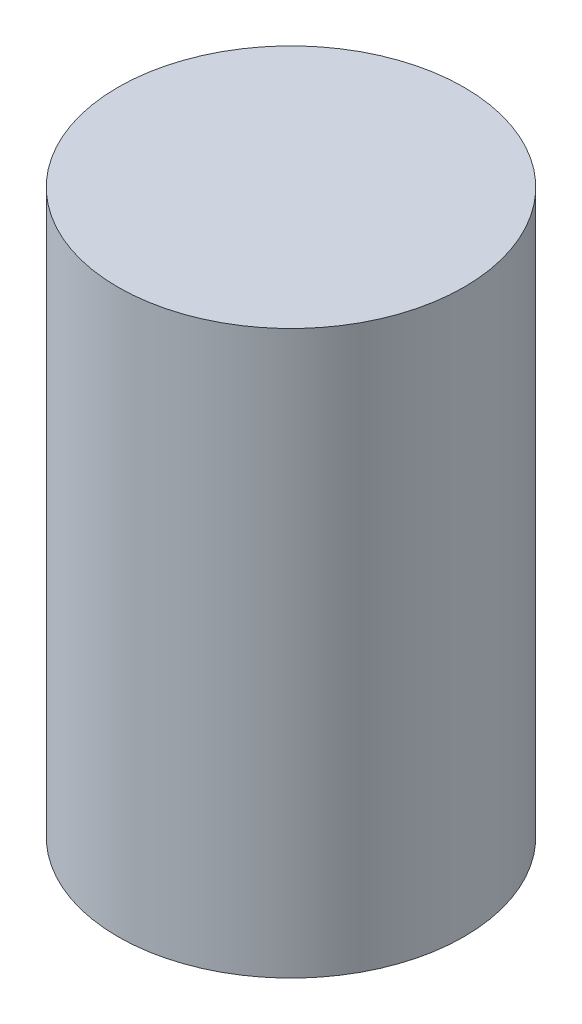
ISO-10303-21;
HEADER;
FILE_DESCRIPTION(('STEP AP214'),'2;1');
FILE_NAME('part.step','',(''),(''),'','','');
FILE_SCHEMA(('AUTOMOTIVE_DESIGN { 1 0 10303 214 1 1 1 1 }'));
ENDSEC;
DATA;
#1=APPLICATION_CONTEXT('core data for automotive mechanical design processes');
#2=APPLICATION_PROTOCOL_DEFINITION('international standard','automotive_design',2000,#1);
#3=PRODUCT_CONTEXT('',#1,'mechanical');
#4=PRODUCT('Part','Part','',(#3));
#5=PRODUCT_RELATED_PRODUCT_CATEGORY('part','',(#4));
#6=PRODUCT_DEFINITION_FORMATION('','',#4);
#7=PRODUCT_DEFINITION_CONTEXT('part definition',#1,'design');
#8=PRODUCT_DEFINITION('design','',#6,#7);
#9=PRODUCT_DEFINITION_SHAPE('','',#8);
#10=(LENGTH_UNIT() NAMED_UNIT(*) SI_UNIT(.MILLI.,.METRE.));
#11=(NAMED_UNIT(*) PLANE_ANGLE_UNIT() SI_UNIT($,.RADIAN.));
#12=(NAMED_UNIT(*) SI_UNIT($,.STERADIAN.) SOLID_ANGLE_UNIT());
#13=UNCERTAINTY_MEASURE_WITH_UNIT(LENGTH_MEASURE(1.E-05),#10,'distance_accuracy_value','');
#14=(GEOMETRIC_REPRESENTATION_CONTEXT(3) GLOBAL_UNCERTAINTY_ASSIGNED_CONTEXT((#13)) GLOBAL_UNIT_ASSIGNED_CONTEXT((#10,
#11,#12)) REPRESENTATION_CONTEXT('',''));
#15=CARTESIAN_POINT('',(0.,0.,0.));
#16=DIRECTION('',(0.,0.,1.));
#17=DIRECTION('',(1.,0.,0.));
#18=AXIS2_PLACEMENT_3D('',#15,#16,#17);
#19=CARTESIAN_POINT('',(-44.,29.,-44.));
#20=DIRECTION('',(0.,-1.,0.));
#21=DIRECTION('',(0.,0.,-1.));
#22=AXIS2_PLACEMENT_3D('',#19,#20,#21);
#23=CYLINDRICAL_SURFACE('',#22,8.);
#24=CARTESIAN_POINT('',(-44.,29.,-44.));
#25=DIRECTION('',(0.,1.,0.));
#26=DIRECTION('',(0.,0.,1.));
#27=AXIS2_PLACEMENT_3D('',#24,#25,#26);
#28=CIRCLE('',#27,8.);
#29=CARTESIAN_POINT('',(-44.,29.,-52.));
#30=VERTEX_POINT('',#29);
#31=EDGE_CURVE('E10',#30,#30,#28,.T.);
#32=CARTESIAN_POINT('',(-44.,3.,-44.));
#33=DIRECTION('',(0.,1.,0.));
#34=DIRECTION('',(0.,0.,1.));
#35=AXIS2_PLACEMENT_3D('',#32,#33,#34);
#36=CIRCLE('',#35,8.);
#37=CARTESIAN_POINT('',(-44.,3.,-52.));
#38=VERTEX_POINT('',#37);
#39=EDGE_CURVE('E37',#38,#38,#36,.T.);
#40=CARTESIAN_POINT('',(-44.,29.,-52.));
#41=CARTESIAN_POINT('',(-44.,28.7291666666667,-52.));
#42=CARTESIAN_POINT('',(-44.,28.4583333333333,-52.));
#43=CARTESIAN_POINT('',(-44.,27.9166666666667,-52.));
#44=CARTESIAN_POINT('',(-44.,27.6458333333333,-52.));
#45=CARTESIAN_POINT('',(-44.,27.1041666666667,-52.));
#46=CARTESIAN_POINT('',(-44.,26.8333333333333,-52.));
#47=CARTESIAN_POINT('',(-44.,26.2916666666667,-52.));
#48=CARTESIAN_POINT('',(-44.,26.0208333333333,-52.));
#49=CARTESIAN_POINT('',(-44.,25.4791666666667,-52.));
#50=CARTESIAN_POINT('',(-44.,25.2083333333333,-52.));
#51=CARTESIAN_POINT('',(-44.,24.6666666666667,-52.));
#52=CARTESIAN_POINT('',(-44.,24.3958333333333,-52.));
#53=CARTESIAN_POINT('',(-44.,23.8541666666667,-52.));
#54=CARTESIAN_POINT('',(-44.,23.5833333333333,-52.));
#55=CARTESIAN_POINT('',(-44.,23.0416666666667,-52.));
#56=CARTESIAN_POINT('',(-44.,22.7708333333333,-52.));
#57=CARTESIAN_POINT('',(-44.,22.2291666666667,-52.));
#58=CARTESIAN_POINT('',(-44.,21.9583333333333,-52.));
#59=CARTESIAN_POINT('',(-44.,21.4166666666667,-52.));
#60=CARTESIAN_POINT('',(-44.,21.1458333333333,-52.));
#61=CARTESIAN_POINT('',(-44.,20.6041666666667,-52.));
#62=CARTESIAN_POINT('',(-44.,20.3333333333333,-52.));
#63=CARTESIAN_POINT('',(-44.,19.7916666666667,-52.));
#64=CARTESIAN_POINT('',(-44.,19.5208333333333,-52.));
#65=CARTESIAN_POINT('',(-44.,18.9791666666667,-52.));
#66=CARTESIAN_POINT('',(-44.,18.7083333333333,-52.));
#67=CARTESIAN_POINT('',(-44.,18.1666666666667,-52.));
#68=CARTESIAN_POINT('',(-44.,17.8958333333333,-52.));
#69=CARTESIAN_POINT('',(-44.,17.3541666666667,-52.));
#70=CARTESIAN_POINT('',(-44.,17.0833333333333,-52.));
#71=CARTESIAN_POINT('',(-44.,16.5416666666667,-52.));
#72=CARTESIAN_POINT('',(-44.,16.2708333333333,-52.));
#73=CARTESIAN_POINT('',(-44.,15.7291666666667,-52.));
#74=CARTESIAN_POINT('',(-44.,15.4583333333333,-52.));
#75=CARTESIAN_POINT('',(-44.,14.9166666666667,-52.));
#76=CARTESIAN_POINT('',(-44.,14.6458333333333,-52.));
#77=CARTESIAN_POINT('',(-44.,14.1041666666667,-52.));
#78=CARTESIAN_POINT('',(-44.,13.8333333333333,-52.));
#79=CARTESIAN_POINT('',(-44.,13.2916666666667,-52.));
#80=CARTESIAN_POINT('',(-44.,13.0208333333333,-52.));
#81=CARTESIAN_POINT('',(-44.,12.4791666666667,-52.));
#82=CARTESIAN_POINT('',(-44.,12.2083333333333,-52.));
#83=CARTESIAN_POINT('',(-44.,11.6666666666667,-52.));
#84=CARTESIAN_POINT('',(-44.,11.3958333333333,-52.));
#85=CARTESIAN_POINT('',(-44.,10.8541666666667,-52.));
#86=CARTESIAN_POINT('',(-44.,10.5833333333333,-52.));
#87=CARTESIAN_POINT('',(-44.,10.0416666666667,-52.));
#88=CARTESIAN_POINT('',(-44.,9.77083333333333,-52.));
#89=CARTESIAN_POINT('',(-44.,9.22916666666666,-52.));
#90=CARTESIAN_POINT('',(-44.,8.95833333333333,-52.));
#91=CARTESIAN_POINT('',(-44.,8.41666666666666,-52.));
#92=CARTESIAN_POINT('',(-44.,8.14583333333333,-52.));
#93=CARTESIAN_POINT('',(-44.,7.60416666666667,-52.));
#94=CARTESIAN_POINT('',(-44.,7.33333333333333,-52.));
#95=CARTESIAN_POINT('',(-44.,6.79166666666667,-52.));
#96=CARTESIAN_POINT('',(-44.,6.52083333333333,-52.));
#97=CARTESIAN_POINT('',(-44.,5.97916666666667,-52.));
#98=CARTESIAN_POINT('',(-44.,5.70833333333333,-52.));
#99=CARTESIAN_POINT('',(-44.,5.16666666666667,-52.));
#100=CARTESIAN_POINT('',(-44.,4.89583333333333,-52.));
#101=CARTESIAN_POINT('',(-44.,4.35416666666667,-52.));
#102=CARTESIAN_POINT('',(-44.,4.08333333333333,-52.));
#103=CARTESIAN_POINT('',(-44.,3.54166666666667,-52.));
#104=CARTESIAN_POINT('',(-44.,3.27083333333333,-52.));
#105=CARTESIAN_POINT('',(-44.,3.,-52.));
#106=B_SPLINE_CURVE_WITH_KNOTS('',3,(#40,#41,#42,#43,#44,#45,#46,#47,#48,#49,#50,#51,#52,#53,
#54,#55,#56,#57,#58,#59,#60,#61,#62,#63,#64,#65,#66,#67,#68,#69,#70,#71,#72,#73,#74,#75,#76,#77,
#78,#79,#80,#81,#82,#83,#84,#85,#86,#87,#88,#89,#90,#91,#92,#93,#94,#95,#96,#97,#98,#99,#100,
#101,#102,#103,#104,#105),.UNSPECIFIED.,.F.,.F.,(4,2,2,2,2,2,2,2,2,2,2,2,2,2,2,2,2,2,2,2,2,2,2,
2,2,2,2,2,2,2,2,2,4),(0.,0.812499999999997,1.625,2.4375,3.25,4.0625,4.875,5.6875,6.5,7.3125,
8.125,8.9375,9.75,10.5625,11.375,12.1875,13.,13.8125,14.625,15.4375,16.25,17.0625,17.875,
18.6875,19.5,20.3125,21.125,21.9375,22.75,23.5625,24.375,25.1875,26.),.UNSPECIFIED.);
#107=EDGE_CURVE('BSEAM40',#30,#38,#106,.T.);
#108=ORIENTED_EDGE('',*,*,#31,.F.);
#109=ORIENTED_EDGE('',*,*,#39,.T.);
#110=ORIENTED_EDGE('',*,*,#107,.T.);
#111=ORIENTED_EDGE('',*,*,#107,.F.);
#112=EDGE_LOOP('',(#108,#110,#109,#111));
#113=FACE_BOUND('',#112,.T.);
#114=ADVANCED_FACE('F40',(#113),#23,.T.);
#115=CARTESIAN_POINT('',(-44.,29.,-44.));
#116=DIRECTION('',(0.,1.,0.));
#117=DIRECTION('',(0.,0.,1.));
#118=AXIS2_PLACEMENT_3D('',#115,#116,#117);
#119=PLANE('',#118);
#120=ORIENTED_EDGE('',*,*,#31,.T.);
#121=EDGE_LOOP('',(#120));
#122=FACE_BOUND('',#121,.T.);
#123=ADVANCED_FACE('F55',(#122),#119,.T.);
#124=CARTESIAN_POINT('',(-44.,3.,-44.));
#125=DIRECTION('',(0.,1.,0.));
#126=DIRECTION('',(0.,0.,1.));
#127=AXIS2_PLACEMENT_3D('',#124,#125,#126);
#128=PLANE('',#127);
#129=ORIENTED_EDGE('',*,*,#39,.F.);
#130=EDGE_LOOP('',(#129));
#131=FACE_BOUND('',#130,.T.);
#132=ADVANCED_FACE('F49',(#131),#128,.F.);
#133=CLOSED_SHELL('',(#114,#123,#132));
#134=MANIFOLD_SOLID_BREP('B2',#133);
#135=ADVANCED_BREP_SHAPE_REPRESENTATION('',(#18,#134),#14);
#136=SHAPE_DEFINITION_REPRESENTATION(#9,#135);
ENDSEC;
END-ISO-10303-21;
